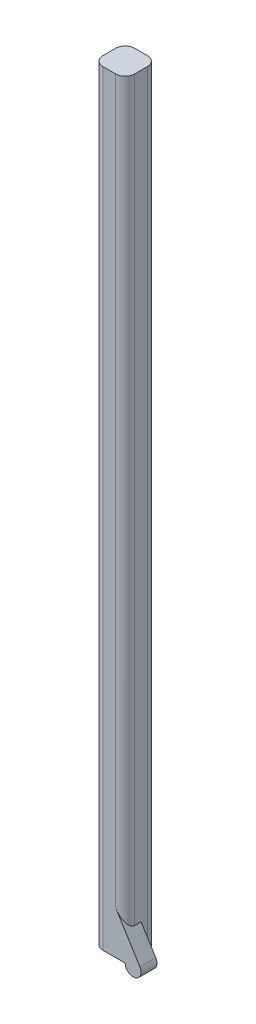
ISO-10303-21;
HEADER;
FILE_DESCRIPTION(('STEP AP214'),'2;1');
FILE_NAME('part.step','',(''),(''),'','','');
FILE_SCHEMA(('AUTOMOTIVE_DESIGN { 1 0 10303 214 1 1 1 1 }'));
ENDSEC;
DATA;
#1=APPLICATION_CONTEXT('core data for automotive mechanical design processes');
#2=APPLICATION_PROTOCOL_DEFINITION('international standard','automotive_design',2000,#1);
#3=PRODUCT_CONTEXT('',#1,'mechanical');
#4=PRODUCT('Part','Part','',(#3));
#5=PRODUCT_RELATED_PRODUCT_CATEGORY('part','',(#4));
#6=PRODUCT_DEFINITION_FORMATION('','',#4);
#7=PRODUCT_DEFINITION_CONTEXT('part definition',#1,'design');
#8=PRODUCT_DEFINITION('design','',#6,#7);
#9=PRODUCT_DEFINITION_SHAPE('','',#8);
#10=(LENGTH_UNIT() NAMED_UNIT(*) SI_UNIT(.MILLI.,.METRE.));
#11=(NAMED_UNIT(*) PLANE_ANGLE_UNIT() SI_UNIT($,.RADIAN.));
#12=(NAMED_UNIT(*) SI_UNIT($,.STERADIAN.) SOLID_ANGLE_UNIT());
#13=UNCERTAINTY_MEASURE_WITH_UNIT(LENGTH_MEASURE(1.E-05),#10,'distance_accuracy_value','');
#14=(GEOMETRIC_REPRESENTATION_CONTEXT(3) GLOBAL_UNCERTAINTY_ASSIGNED_CONTEXT((#13)) GLOBAL_UNIT_ASSIGNED_CONTEXT((#10,
#11,#12)) REPRESENTATION_CONTEXT('',''));
#15=CARTESIAN_POINT('',(0.,0.,0.));
#16=DIRECTION('',(0.,0.,1.));
#17=DIRECTION('',(1.,0.,0.));
#18=AXIS2_PLACEMENT_3D('',#15,#16,#17);
#19=CARTESIAN_POINT('',(-5.,241.,5.));
#20=DIRECTION('',(1.,0.,0.));
#21=DIRECTION('',(0.,0.,-1.));
#22=AXIS2_PLACEMENT_3D('',#19,#20,#21);
#23=PLANE('',#22);
#24=DIRECTION('',(0.,0.,1.));
#25=VECTOR('',#24,1.);
#26=CARTESIAN_POINT('',(-5.,241.,5.));
#27=LINE('',#26,#25);
#28=CARTESIAN_POINT('',(-5.,241.,-2.));
#29=VERTEX_POINT('',#28);
#30=CARTESIAN_POINT('',(-5.,241.,2.));
#31=VERTEX_POINT('',#30);
#32=EDGE_CURVE('E143',#29,#31,#27,.T.);
#33=ORIENTED_EDGE('',*,*,#32,.F.);
#34=DIRECTION('',(0.,-1.,0.));
#35=VECTOR('',#34,1.);
#36=CARTESIAN_POINT('',(-5.,241.,-2.));
#37=LINE('',#36,#35);
#38=CARTESIAN_POINT('',(-5.,0.,-2.));
#39=VERTEX_POINT('',#38);
#40=EDGE_CURVE('E189',#29,#39,#37,.T.);
#41=ORIENTED_EDGE('',*,*,#40,.T.);
#42=DIRECTION('',(0.,0.,1.));
#43=VECTOR('',#42,1.);
#44=CARTESIAN_POINT('',(-5.,0.,5.));
#45=LINE('',#44,#43);
#46=CARTESIAN_POINT('',(-5.,0.,2.));
#47=VERTEX_POINT('',#46);
#48=EDGE_CURVE('E141',#39,#47,#45,.T.);
#49=ORIENTED_EDGE('',*,*,#48,.T.);
#50=DIRECTION('',(0.,-1.,0.));
#51=VECTOR('',#50,1.);
#52=CARTESIAN_POINT('',(-5.,241.,2.));
#53=LINE('',#52,#51);
#54=EDGE_CURVE('E187',#47,#31,#53,.F.);
#55=ORIENTED_EDGE('',*,*,#54,.T.);
#56=EDGE_LOOP('',(#33,#41,#49,#55));
#57=FACE_BOUND('',#56,.T.);
#58=ADVANCED_FACE('F35',(#57),#23,.F.);
#59=CARTESIAN_POINT('',(5.,241.,5.));
#60=DIRECTION('',(0.,0.,-1.));
#61=DIRECTION('',(-1.,0.,0.));
#62=AXIS2_PLACEMENT_3D('',#59,#60,#61);
#63=PLANE('',#62);
#64=DIRECTION('',(-0.527423645147466,0.849602435577582,0.));
#65=VECTOR('',#64,1.);
#66=CARTESIAN_POINT('',(5.,8.76715735346128,5.));
#67=LINE('',#66,#65);
#68=CARTESIAN_POINT('',(9.62400608894396,1.31855911286866,5.));
#69=VERTEX_POINT('',#68);
#70=CARTESIAN_POINT('',(2.,13.5997190525488,5.));
#71=VERTEX_POINT('',#70);
#72=EDGE_CURVE('E50',#69,#71,#67,.T.);
#73=ORIENTED_EDGE('',*,*,#72,.T.);
#74=DIRECTION('',(0.,-1.,0.));
#75=VECTOR('',#74,1.);
#76=CARTESIAN_POINT('',(2.,241.,5.));
#77=LINE('',#76,#75);
#78=CARTESIAN_POINT('',(2.,241.,5.));
#79=VERTEX_POINT('',#78);
#80=EDGE_CURVE('E43',#71,#79,#77,.F.);
#81=ORIENTED_EDGE('',*,*,#80,.T.);
#82=DIRECTION('',(1.,0.,0.));
#83=VECTOR('',#82,1.);
#84=CARTESIAN_POINT('',(5.,241.,5.));
#85=LINE('',#84,#83);
#86=CARTESIAN_POINT('',(-2.,241.,5.));
#87=VERTEX_POINT('',#86);
#88=EDGE_CURVE('E146',#87,#79,#85,.T.);
#89=ORIENTED_EDGE('',*,*,#88,.F.);
#90=DIRECTION('',(0.,-1.,0.));
#91=VECTOR('',#90,1.);
#92=CARTESIAN_POINT('',(-2.,241.,5.));
#93=LINE('',#92,#91);
#94=CARTESIAN_POINT('',(-2.,0.,5.));
#95=VERTEX_POINT('',#94);
#96=EDGE_CURVE('E192',#87,#95,#93,.T.);
#97=ORIENTED_EDGE('',*,*,#96,.T.);
#98=DIRECTION('',(1.,0.,0.));
#99=VECTOR('',#98,1.);
#100=CARTESIAN_POINT('',(5.,0.,5.));
#101=LINE('',#100,#99);
#102=CARTESIAN_POINT('',(5.,0.,5.));
#103=VERTEX_POINT('',#102);
#104=EDGE_CURVE('E158',#95,#103,#101,.T.);
#105=ORIENTED_EDGE('',*,*,#104,.T.);
#106=CARTESIAN_POINT('',(7.5,0.,5.));
#107=DIRECTION('',(0.,0.,1.));
#108=DIRECTION('',(-1.,0.,0.));
#109=AXIS2_PLACEMENT_3D('',#106,#107,#108);
#110=CIRCLE('',#109,2.5);
#111=EDGE_CURVE('E136',#103,#69,#110,.T.);
#112=ORIENTED_EDGE('',*,*,#111,.T.);
#113=EDGE_LOOP('',(#73,#81,#89,#97,#105,#112));
#114=FACE_BOUND('',#113,.T.);
#115=ADVANCED_FACE('F196',(#114),#63,.F.);
#116=CARTESIAN_POINT('',(5.,241.,5.));
#117=DIRECTION('',(-1.,0.,0.));
#118=DIRECTION('',(0.,0.,1.));
#119=AXIS2_PLACEMENT_3D('',#116,#117,#118);
#120=PLANE('',#119);
#121=DIRECTION('',(0.,0.,-1.));
#122=VECTOR('',#121,1.);
#123=CARTESIAN_POINT('',(5.,0.,5.));
#124=LINE('',#123,#122);
#125=CARTESIAN_POINT('',(5.,0.,0.));
#126=VERTEX_POINT('',#125);
#127=CARTESIAN_POINT('',(5.,0.,-2.));
#128=VERTEX_POINT('',#127);
#129=EDGE_CURVE('E160',#126,#128,#124,.T.);
#130=ORIENTED_EDGE('',*,*,#129,.T.);
#131=DIRECTION('',(0.,-1.,0.));
#132=VECTOR('',#131,1.);
#133=CARTESIAN_POINT('',(5.,241.,-2.));
#134=LINE('',#133,#132);
#135=CARTESIAN_POINT('',(5.,241.,-2.));
#136=VERTEX_POINT('',#135);
#137=EDGE_CURVE('E177',#128,#136,#134,.F.);
#138=ORIENTED_EDGE('',*,*,#137,.T.);
#139=DIRECTION('',(0.,0.,-1.));
#140=VECTOR('',#139,1.);
#141=CARTESIAN_POINT('',(5.,241.,5.));
#142=LINE('',#141,#140);
#143=CARTESIAN_POINT('',(5.,241.,2.));
#144=VERTEX_POINT('',#143);
#145=EDGE_CURVE('E149',#144,#136,#142,.T.);
#146=ORIENTED_EDGE('',*,*,#145,.F.);
#147=DIRECTION('',(0.,-1.,0.));
#148=VECTOR('',#147,1.);
#149=CARTESIAN_POINT('',(5.,241.,2.));
#150=LINE('',#149,#148);
#151=CARTESIAN_POINT('',(5.,8.76715735346128,2.));
#152=VERTEX_POINT('',#151);
#153=EDGE_CURVE('E174',#144,#152,#150,.T.);
#154=ORIENTED_EDGE('',*,*,#153,.T.);
#155=DIRECTION('',(0.,0.,1.));
#156=VECTOR('',#155,1.);
#157=CARTESIAN_POINT('',(5.,8.76715735346128,0.));
#158=LINE('',#157,#156);
#159=CARTESIAN_POINT('',(5.,8.76715735346129,0.));
#160=VERTEX_POINT('',#159);
#161=EDGE_CURVE('E122',#160,#152,#158,.T.);
#162=ORIENTED_EDGE('',*,*,#161,.F.);
#163=DIRECTION('',(0.,-1.,0.));
#164=VECTOR('',#163,1.);
#165=CARTESIAN_POINT('',(5.,8.76715735346128,0.));
#166=LINE('',#165,#164);
#167=EDGE_CURVE('E123',#160,#126,#166,.T.);
#168=ORIENTED_EDGE('',*,*,#167,.T.);
#169=EDGE_LOOP('',(#130,#138,#146,#154,#162,#168));
#170=FACE_BOUND('',#169,.T.);
#171=ADVANCED_FACE('F206',(#170),#120,.F.);
#172=CARTESIAN_POINT('',(5.,241.,-5.));
#173=DIRECTION('',(0.,0.,1.));
#174=DIRECTION('',(1.,0.,0.));
#175=AXIS2_PLACEMENT_3D('',#172,#173,#174);
#176=PLANE('',#175);
#177=DIRECTION('',(-1.,0.,0.));
#178=VECTOR('',#177,1.);
#179=CARTESIAN_POINT('',(5.,241.,-5.));
#180=LINE('',#179,#178);
#181=CARTESIAN_POINT('',(2.,241.,-5.));
#182=VERTEX_POINT('',#181);
#183=CARTESIAN_POINT('',(-2.,241.,-5.));
#184=VERTEX_POINT('',#183);
#185=EDGE_CURVE('E152',#182,#184,#180,.T.);
#186=ORIENTED_EDGE('',*,*,#185,.F.);
#187=DIRECTION('',(0.,-1.,0.));
#188=VECTOR('',#187,1.);
#189=CARTESIAN_POINT('',(2.,241.,-5.));
#190=LINE('',#189,#188);
#191=CARTESIAN_POINT('',(2.,0.,-5.));
#192=VERTEX_POINT('',#191);
#193=EDGE_CURVE('E165',#182,#192,#190,.T.);
#194=ORIENTED_EDGE('',*,*,#193,.T.);
#195=DIRECTION('',(-1.,0.,0.));
#196=VECTOR('',#195,1.);
#197=CARTESIAN_POINT('',(5.,0.,-5.));
#198=LINE('',#197,#196);
#199=CARTESIAN_POINT('',(-2.,0.,-5.));
#200=VERTEX_POINT('',#199);
#201=EDGE_CURVE('E147',#192,#200,#198,.T.);
#202=ORIENTED_EDGE('',*,*,#201,.T.);
#203=DIRECTION('',(0.,-1.,0.));
#204=VECTOR('',#203,1.);
#205=CARTESIAN_POINT('',(-2.,241.,-5.));
#206=LINE('',#205,#204);
#207=EDGE_CURVE('E155',#200,#184,#206,.F.);
#208=ORIENTED_EDGE('',*,*,#207,.T.);
#209=EDGE_LOOP('',(#186,#194,#202,#208));
#210=FACE_BOUND('',#209,.T.);
#211=ADVANCED_FACE('F221',(#210),#176,.F.);
#212=CARTESIAN_POINT('',(0.,241.,0.));
#213=DIRECTION('',(0.,1.,0.));
#214=DIRECTION('',(0.,0.,1.));
#215=AXIS2_PLACEMENT_3D('',#212,#213,#214);
#216=PLANE('',#215);
#217=ORIENTED_EDGE('',*,*,#145,.T.);
#218=CARTESIAN_POINT('',(2.,241.,-2.));
#219=DIRECTION('',(0.,1.,0.));
#220=DIRECTION('',(0.,0.,1.));
#221=AXIS2_PLACEMENT_3D('',#218,#219,#220);
#222=CIRCLE('',#221,3.);
#223=EDGE_CURVE('E185',#136,#182,#222,.T.);
#224=ORIENTED_EDGE('',*,*,#223,.T.);
#225=ORIENTED_EDGE('',*,*,#185,.T.);
#226=CARTESIAN_POINT('',(-2.,241.,-2.));
#227=DIRECTION('',(0.,1.,0.));
#228=DIRECTION('',(0.,0.,1.));
#229=AXIS2_PLACEMENT_3D('',#226,#227,#228);
#230=CIRCLE('',#229,3.);
#231=EDGE_CURVE('E183',#184,#29,#230,.T.);
#232=ORIENTED_EDGE('',*,*,#231,.T.);
#233=ORIENTED_EDGE('',*,*,#32,.T.);
#234=CARTESIAN_POINT('',(-2.,241.,2.));
#235=DIRECTION('',(0.,1.,0.));
#236=DIRECTION('',(0.,0.,1.));
#237=AXIS2_PLACEMENT_3D('',#234,#235,#236);
#238=CIRCLE('',#237,3.);
#239=EDGE_CURVE('E179',#31,#87,#238,.T.);
#240=ORIENTED_EDGE('',*,*,#239,.T.);
#241=ORIENTED_EDGE('',*,*,#88,.T.);
#242=CARTESIAN_POINT('',(2.,241.,2.));
#243=DIRECTION('',(0.,1.,0.));
#244=DIRECTION('',(0.,0.,1.));
#245=AXIS2_PLACEMENT_3D('',#242,#243,#244);
#246=CIRCLE('',#245,3.);
#247=EDGE_CURVE('E181',#79,#144,#246,.T.);
#248=ORIENTED_EDGE('',*,*,#247,.T.);
#249=EDGE_LOOP('',(#217,#224,#225,#232,#233,#240,#241,#248));
#250=FACE_BOUND('',#249,.T.);
#251=ADVANCED_FACE('F213',(#250),#216,.T.);
#252=CARTESIAN_POINT('',(0.,0.,0.));
#253=DIRECTION('',(0.,1.,0.));
#254=DIRECTION('',(0.,0.,1.));
#255=AXIS2_PLACEMENT_3D('',#252,#253,#254);
#256=PLANE('',#255);
#257=ORIENTED_EDGE('',*,*,#201,.F.);
#258=CARTESIAN_POINT('',(2.,0.,-2.));
#259=DIRECTION('',(0.,1.,0.));
#260=DIRECTION('',(0.,0.,1.));
#261=AXIS2_PLACEMENT_3D('',#258,#259,#260);
#262=CIRCLE('',#261,3.);
#263=EDGE_CURVE('E172',#192,#128,#262,.F.);
#264=ORIENTED_EDGE('',*,*,#263,.T.);
#265=ORIENTED_EDGE('',*,*,#129,.F.);
#266=EDGE_CURVE('E134',#103,#126,#124,.T.);
#267=ORIENTED_EDGE('',*,*,#266,.F.);
#268=ORIENTED_EDGE('',*,*,#104,.F.);
#269=CARTESIAN_POINT('',(-2.,0.,2.));
#270=DIRECTION('',(0.,1.,0.));
#271=DIRECTION('',(0.,0.,1.));
#272=AXIS2_PLACEMENT_3D('',#269,#270,#271);
#273=CIRCLE('',#272,3.);
#274=EDGE_CURVE('E168',#95,#47,#273,.F.);
#275=ORIENTED_EDGE('',*,*,#274,.T.);
#276=ORIENTED_EDGE('',*,*,#48,.F.);
#277=CARTESIAN_POINT('',(-2.,0.,-2.));
#278=DIRECTION('',(0.,1.,0.));
#279=DIRECTION('',(0.,0.,1.));
#280=AXIS2_PLACEMENT_3D('',#277,#278,#279);
#281=CIRCLE('',#280,3.);
#282=EDGE_CURVE('E170',#39,#200,#281,.F.);
#283=ORIENTED_EDGE('',*,*,#282,.T.);
#284=EDGE_LOOP('',(#257,#264,#265,#267,#268,#275,#276,#283));
#285=FACE_BOUND('',#284,.T.);
#286=ADVANCED_FACE('F201',(#285),#256,.F.);
#287=CARTESIAN_POINT('',(7.5,0.,0.));
#288=DIRECTION('',(0.,0.,1.));
#289=DIRECTION('',(1.,0.,0.));
#290=AXIS2_PLACEMENT_3D('',#287,#288,#289);
#291=CYLINDRICAL_SURFACE('',#290,2.5);
#292=ORIENTED_EDGE('',*,*,#111,.F.);
#293=ORIENTED_EDGE('',*,*,#266,.T.);
#294=CARTESIAN_POINT('',(7.5,0.,0.));
#295=DIRECTION('',(0.,0.,1.));
#296=DIRECTION('',(-1.,0.,0.));
#297=AXIS2_PLACEMENT_3D('',#294,#295,#296);
#298=CIRCLE('',#297,2.5);
#299=CARTESIAN_POINT('',(9.62400608894396,1.31855911286866,0.));
#300=VERTEX_POINT('',#299);
#301=EDGE_CURVE('E128',#126,#300,#298,.T.);
#302=ORIENTED_EDGE('',*,*,#301,.T.);
#303=DIRECTION('',(0.,0.,1.));
#304=VECTOR('',#303,1.);
#305=CARTESIAN_POINT('',(9.62400608894396,1.31855911286866,0.));
#306=LINE('',#305,#304);
#307=EDGE_CURVE('E113',#300,#69,#306,.T.);
#308=ORIENTED_EDGE('',*,*,#307,.T.);
#309=EDGE_LOOP('',(#292,#293,#302,#308));
#310=FACE_BOUND('',#309,.T.);
#311=ADVANCED_FACE('F132',(#310),#291,.T.);
#312=CARTESIAN_POINT('',(5.,8.76715735346128,0.));
#313=DIRECTION('',(0.849602435577583,0.527423645147466,0.));
#314=DIRECTION('',(-0.527423645147466,0.849602435577583,0.));
#315=AXIS2_PLACEMENT_3D('',#312,#313,#314);
#316=PLANE('',#315);
#317=ORIENTED_EDGE('',*,*,#72,.F.);
#318=ORIENTED_EDGE('',*,*,#307,.F.);
#319=DIRECTION('',(-0.527423645147466,0.849602435577582,0.));
#320=VECTOR('',#319,1.);
#321=CARTESIAN_POINT('',(5.,8.76715735346128,0.));
#322=LINE('',#321,#320);
#323=EDGE_CURVE('E117',#300,#160,#322,.T.);
#324=ORIENTED_EDGE('',*,*,#323,.T.);
#325=ORIENTED_EDGE('',*,*,#161,.T.);
#326=CARTESIAN_POINT('',(2.,13.5997190525488,2.));
#327=DIRECTION('',(0.849602435577583,0.527423645147466,0.));
#328=DIRECTION('',(0.527423645147466,-0.849602435577583,0.));
#329=AXIS2_PLACEMENT_3D('',#326,#327,#328);
#330=ELLIPSE('',#329,5.68802712506606,3.);
#331=EDGE_CURVE('E11',#152,#71,#330,.F.);
#332=ORIENTED_EDGE('',*,*,#331,.T.);
#333=EDGE_LOOP('',(#317,#318,#324,#325,#332));
#334=FACE_BOUND('',#333,.T.);
#335=ADVANCED_FACE('F115',(#334),#316,.T.);
#336=CARTESIAN_POINT('',(7.5,0.,0.));
#337=DIRECTION('',(0.,0.,-1.));
#338=DIRECTION('',(-1.,0.,0.));
#339=AXIS2_PLACEMENT_3D('',#336,#337,#338);
#340=PLANE('',#339);
#341=ORIENTED_EDGE('',*,*,#301,.F.);
#342=ORIENTED_EDGE('',*,*,#167,.F.);
#343=ORIENTED_EDGE('',*,*,#323,.F.);
#344=EDGE_LOOP('',(#341,#342,#343));
#345=FACE_BOUND('',#344,.T.);
#346=ADVANCED_FACE('F127',(#345),#340,.T.);
#347=CARTESIAN_POINT('',(2.,241.,-2.));
#348=DIRECTION('',(0.,-1.,0.));
#349=DIRECTION('',(0.,0.,-1.));
#350=AXIS2_PLACEMENT_3D('',#347,#348,#349);
#351=CYLINDRICAL_SURFACE('',#350,3.);
#352=ORIENTED_EDGE('',*,*,#223,.F.);
#353=ORIENTED_EDGE('',*,*,#137,.F.);
#354=ORIENTED_EDGE('',*,*,#263,.F.);
#355=ORIENTED_EDGE('',*,*,#193,.F.);
#356=EDGE_LOOP('',(#352,#353,#354,#355));
#357=FACE_BOUND('',#356,.T.);
#358=ADVANCED_FACE('F216',(#357),#351,.T.);
#359=CARTESIAN_POINT('',(-2.,241.,-2.));
#360=DIRECTION('',(0.,-1.,0.));
#361=DIRECTION('',(0.,0.,-1.));
#362=AXIS2_PLACEMENT_3D('',#359,#360,#361);
#363=CYLINDRICAL_SURFACE('',#362,3.);
#364=ORIENTED_EDGE('',*,*,#231,.F.);
#365=ORIENTED_EDGE('',*,*,#207,.F.);
#366=ORIENTED_EDGE('',*,*,#282,.F.);
#367=ORIENTED_EDGE('',*,*,#40,.F.);
#368=EDGE_LOOP('',(#364,#365,#366,#367));
#369=FACE_BOUND('',#368,.T.);
#370=ADVANCED_FACE('F224',(#369),#363,.T.);
#371=CARTESIAN_POINT('',(2.,241.,2.));
#372=DIRECTION('',(0.,-1.,0.));
#373=DIRECTION('',(0.,0.,-1.));
#374=AXIS2_PLACEMENT_3D('',#371,#372,#373);
#375=CYLINDRICAL_SURFACE('',#374,3.);
#376=ORIENTED_EDGE('',*,*,#247,.F.);
#377=ORIENTED_EDGE('',*,*,#80,.F.);
#378=ORIENTED_EDGE('',*,*,#331,.F.);
#379=ORIENTED_EDGE('',*,*,#153,.F.);
#380=EDGE_LOOP('',(#376,#377,#378,#379));
#381=FACE_BOUND('',#380,.T.);
#382=ADVANCED_FACE('F211',(#381),#375,.T.);
#383=CARTESIAN_POINT('',(-2.,241.,2.));
#384=DIRECTION('',(0.,-1.,0.));
#385=DIRECTION('',(0.,0.,-1.));
#386=AXIS2_PLACEMENT_3D('',#383,#384,#385);
#387=CYLINDRICAL_SURFACE('',#386,3.);
#388=ORIENTED_EDGE('',*,*,#239,.F.);
#389=ORIENTED_EDGE('',*,*,#54,.F.);
#390=ORIENTED_EDGE('',*,*,#274,.F.);
#391=ORIENTED_EDGE('',*,*,#96,.F.);
#392=EDGE_LOOP('',(#388,#389,#390,#391));
#393=FACE_BOUND('',#392,.T.);
#394=ADVANCED_FACE('F37',(#393),#387,.T.);
#395=CLOSED_SHELL('',(#58,#115,#171,#211,#251,#286,#311,#335,#346,#358,#370,#382,#394));
#396=MANIFOLD_SOLID_BREP('B2',#395);
#397=ADVANCED_BREP_SHAPE_REPRESENTATION('',(#18,#396),#14);
#398=SHAPE_DEFINITION_REPRESENTATION(#9,#397);
ENDSEC;
END-ISO-10303-21;
